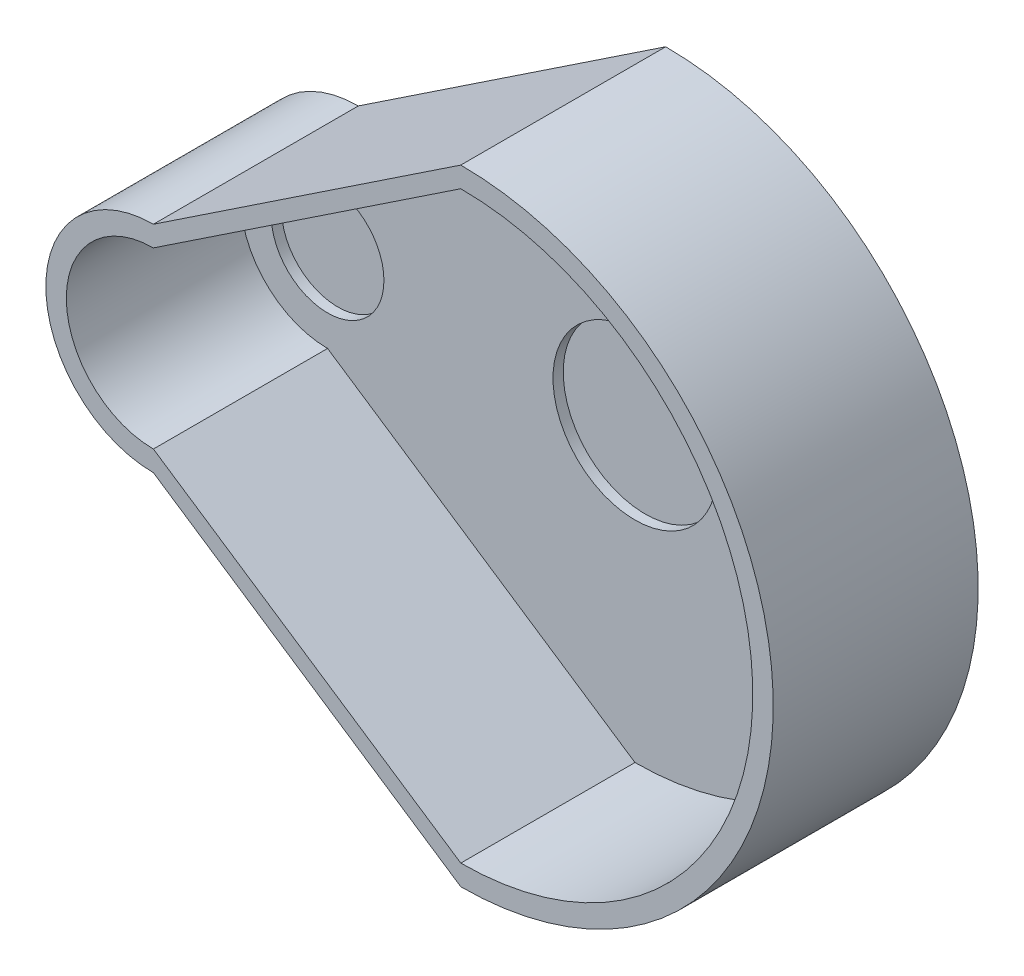
ISO-10303-21;
HEADER;
FILE_DESCRIPTION(('STEP AP214'),'2;1');
FILE_NAME('part.step','',(''),(''),'','','');
FILE_SCHEMA(('AUTOMOTIVE_DESIGN { 1 0 10303 214 1 1 1 1 }'));
ENDSEC;
DATA;
#1=APPLICATION_CONTEXT('core data for automotive mechanical design processes');
#2=APPLICATION_PROTOCOL_DEFINITION('international standard','automotive_design',2000,#1);
#3=PRODUCT_CONTEXT('',#1,'mechanical');
#4=PRODUCT('Part','Part','',(#3));
#5=PRODUCT_RELATED_PRODUCT_CATEGORY('part','',(#4));
#6=PRODUCT_DEFINITION_FORMATION('','',#4);
#7=PRODUCT_DEFINITION_CONTEXT('part definition',#1,'design');
#8=PRODUCT_DEFINITION('design','',#6,#7);
#9=PRODUCT_DEFINITION_SHAPE('','',#8);
#10=(LENGTH_UNIT() NAMED_UNIT(*) SI_UNIT(.MILLI.,.METRE.));
#11=(NAMED_UNIT(*) PLANE_ANGLE_UNIT() SI_UNIT($,.RADIAN.));
#12=(NAMED_UNIT(*) SI_UNIT($,.STERADIAN.) SOLID_ANGLE_UNIT());
#13=UNCERTAINTY_MEASURE_WITH_UNIT(LENGTH_MEASURE(1.E-05),#10,'distance_accuracy_value','');
#14=(GEOMETRIC_REPRESENTATION_CONTEXT(3) GLOBAL_UNCERTAINTY_ASSIGNED_CONTEXT((#13)) GLOBAL_UNIT_ASSIGNED_CONTEXT((#10,
#11,#12)) REPRESENTATION_CONTEXT('',''));
#15=CARTESIAN_POINT('',(0.,0.,0.));
#16=DIRECTION('',(0.,0.,1.));
#17=DIRECTION('',(1.,0.,0.));
#18=AXIS2_PLACEMENT_3D('',#15,#16,#17);
#19=CARTESIAN_POINT('',(0.,0.,20.));
#20=DIRECTION('',(0.,0.,-1.));
#21=DIRECTION('',(-1.,0.,0.));
#22=AXIS2_PLACEMENT_3D('',#19,#20,#21);
#23=CYLINDRICAL_SURFACE('',#22,21.);
#24=CARTESIAN_POINT('',(0.,0.,-20.));
#25=DIRECTION('',(0.,0.,1.));
#26=DIRECTION('',(1.,0.,0.));
#27=AXIS2_PLACEMENT_3D('',#24,#25,#26);
#28=CIRCLE('',#27,21.);
#29=CARTESIAN_POINT('',(0.,21.,-20.));
#30=VERTEX_POINT('',#29);
#31=CARTESIAN_POINT('',(0.,-21.,-20.));
#32=VERTEX_POINT('',#31);
#33=EDGE_CURVE('E153',#30,#32,#28,.T.);
#34=ORIENTED_EDGE('',*,*,#33,.T.);
#35=DIRECTION('',(0.,0.,-1.));
#36=VECTOR('',#35,1.);
#37=CARTESIAN_POINT('',(0.,-21.,20.));
#38=LINE('',#37,#36);
#39=CARTESIAN_POINT('',(0.,-21.,20.));
#40=VERTEX_POINT('',#39);
#41=EDGE_CURVE('E11',#40,#32,#38,.T.);
#42=ORIENTED_EDGE('',*,*,#41,.F.);
#43=CARTESIAN_POINT('',(0.,0.,20.));
#44=DIRECTION('',(0.,0.,1.));
#45=DIRECTION('',(1.,0.,0.));
#46=AXIS2_PLACEMENT_3D('',#43,#44,#45);
#47=CIRCLE('',#46,21.);
#48=CARTESIAN_POINT('',(0.,21.,20.));
#49=VERTEX_POINT('',#48);
#50=EDGE_CURVE('E154',#49,#40,#47,.T.);
#51=ORIENTED_EDGE('',*,*,#50,.F.);
#52=DIRECTION('',(0.,0.,-1.));
#53=VECTOR('',#52,1.);
#54=CARTESIAN_POINT('',(0.,21.,20.));
#55=LINE('',#54,#53);
#56=EDGE_CURVE('E161',#49,#30,#55,.T.);
#57=ORIENTED_EDGE('',*,*,#56,.T.);
#58=EDGE_LOOP('',(#34,#42,#51,#57));
#59=FACE_BOUND('',#58,.T.);
#60=ADVANCED_FACE('F36',(#59),#23,.T.);
#61=CARTESIAN_POINT('',(0.,-21.,20.));
#62=DIRECTION('',(0.554700196225229,0.832050294337844,0.));
#63=DIRECTION('',(-0.832050294337844,0.554700196225229,0.));
#64=AXIS2_PLACEMENT_3D('',#61,#62,#63);
#65=PLANE('',#64);
#66=DIRECTION('',(0.832050294337844,-0.554700196225229,0.));
#67=VECTOR('',#66,1.);
#68=CARTESIAN_POINT('',(0.,-21.,-20.));
#69=LINE('',#68,#67);
#70=CARTESIAN_POINT('',(60.,-61.,-20.));
#71=VERTEX_POINT('',#70);
#72=EDGE_CURVE('E162',#32,#71,#69,.T.);
#73=ORIENTED_EDGE('',*,*,#72,.T.);
#74=DIRECTION('',(0.,0.,-1.));
#75=VECTOR('',#74,1.);
#76=CARTESIAN_POINT('',(60.,-61.,20.));
#77=LINE('',#76,#75);
#78=CARTESIAN_POINT('',(60.,-61.,20.));
#79=VERTEX_POINT('',#78);
#80=EDGE_CURVE('E46',#79,#71,#77,.T.);
#81=ORIENTED_EDGE('',*,*,#80,.F.);
#82=DIRECTION('',(0.832050294337844,-0.554700196225229,0.));
#83=VECTOR('',#82,1.);
#84=CARTESIAN_POINT('',(0.,-21.,20.));
#85=LINE('',#84,#83);
#86=EDGE_CURVE('E93',#40,#79,#85,.T.);
#87=ORIENTED_EDGE('',*,*,#86,.F.);
#88=ORIENTED_EDGE('',*,*,#41,.T.);
#89=EDGE_LOOP('',(#73,#81,#87,#88));
#90=FACE_BOUND('',#89,.T.);
#91=ADVANCED_FACE('F202',(#90),#65,.F.);
#92=CARTESIAN_POINT('',(60.0000000000001,0.,20.));
#93=DIRECTION('',(0.,0.,-1.));
#94=DIRECTION('',(-1.,0.,0.));
#95=AXIS2_PLACEMENT_3D('',#92,#93,#94);
#96=CYLINDRICAL_SURFACE('',#95,61.);
#97=CARTESIAN_POINT('',(60.0000000000001,0.,-20.));
#98=DIRECTION('',(0.,0.,1.));
#99=DIRECTION('',(1.,0.,0.));
#100=AXIS2_PLACEMENT_3D('',#97,#98,#99);
#101=CIRCLE('',#100,61.);
#102=CARTESIAN_POINT('',(60.0000000000001,61.,-20.));
#103=VERTEX_POINT('',#102);
#104=EDGE_CURVE('E166',#71,#103,#101,.T.);
#105=ORIENTED_EDGE('',*,*,#104,.T.);
#106=DIRECTION('',(0.,0.,-1.));
#107=VECTOR('',#106,1.);
#108=CARTESIAN_POINT('',(60.0000000000001,61.,20.));
#109=LINE('',#108,#107);
#110=CARTESIAN_POINT('',(60.0000000000001,61.,20.));
#111=VERTEX_POINT('',#110);
#112=EDGE_CURVE('E169',#111,#103,#109,.T.);
#113=ORIENTED_EDGE('',*,*,#112,.F.);
#114=CARTESIAN_POINT('',(60.0000000000001,0.,20.));
#115=DIRECTION('',(0.,0.,1.));
#116=DIRECTION('',(1.,0.,0.));
#117=AXIS2_PLACEMENT_3D('',#114,#115,#116);
#118=CIRCLE('',#117,61.);
#119=EDGE_CURVE('E156',#79,#111,#118,.T.);
#120=ORIENTED_EDGE('',*,*,#119,.F.);
#121=ORIENTED_EDGE('',*,*,#80,.T.);
#122=EDGE_LOOP('',(#105,#113,#120,#121));
#123=FACE_BOUND('',#122,.T.);
#124=ADVANCED_FACE('F207',(#123),#96,.T.);
#125=CARTESIAN_POINT('',(0.,21.,20.));
#126=DIRECTION('',(0.554700196225229,-0.832050294337844,0.));
#127=DIRECTION('',(0.832050294337844,0.554700196225229,0.));
#128=AXIS2_PLACEMENT_3D('',#125,#126,#127);
#129=PLANE('',#128);
#130=DIRECTION('',(-0.832050294337844,-0.554700196225229,0.));
#131=VECTOR('',#130,1.);
#132=CARTESIAN_POINT('',(0.,21.,-20.));
#133=LINE('',#132,#131);
#134=EDGE_CURVE('E84',#103,#30,#133,.T.);
#135=ORIENTED_EDGE('',*,*,#134,.T.);
#136=ORIENTED_EDGE('',*,*,#56,.F.);
#137=DIRECTION('',(-0.832050294337844,-0.554700196225229,0.));
#138=VECTOR('',#137,1.);
#139=CARTESIAN_POINT('',(0.,21.,20.));
#140=LINE('',#139,#138);
#141=EDGE_CURVE('E64',#111,#49,#140,.T.);
#142=ORIENTED_EDGE('',*,*,#141,.F.);
#143=ORIENTED_EDGE('',*,*,#112,.T.);
#144=EDGE_LOOP('',(#135,#136,#142,#143));
#145=FACE_BOUND('',#144,.T.);
#146=ADVANCED_FACE('F216',(#145),#129,.F.);
#147=CARTESIAN_POINT('',(0.,0.,20.));
#148=DIRECTION('',(0.,0.,1.));
#149=DIRECTION('',(1.,0.,0.));
#150=AXIS2_PLACEMENT_3D('',#147,#148,#149);
#151=PLANE('',#150);
#152=CARTESIAN_POINT('',(0.,0.,20.));
#153=DIRECTION('',(0.,0.,1.));
#154=DIRECTION('',(1.,0.,0.));
#155=AXIS2_PLACEMENT_3D('',#152,#153,#154);
#156=CIRCLE('',#155,17.);
#157=CARTESIAN_POINT('',(0.,17.,20.));
#158=VERTEX_POINT('',#157);
#159=CARTESIAN_POINT('',(0.,-17.,20.));
#160=VERTEX_POINT('',#159);
#161=EDGE_CURVE('E53',#158,#160,#156,.T.);
#162=ORIENTED_EDGE('',*,*,#161,.F.);
#163=DIRECTION('',(-0.832050294337841,-0.554700196225233,0.));
#164=VECTOR('',#163,1.);
#165=CARTESIAN_POINT('',(0.,17.,20.));
#166=LINE('',#165,#164);
#167=CARTESIAN_POINT('',(59.9999999999997,57.0000000000002,20.));
#168=VERTEX_POINT('',#167);
#169=EDGE_CURVE('E134',#168,#158,#166,.T.);
#170=ORIENTED_EDGE('',*,*,#169,.F.);
#171=CARTESIAN_POINT('',(59.9999999999997,-2.22044604925031E-13,20.));
#172=DIRECTION('',(0.,0.,1.));
#173=DIRECTION('',(1.,0.,0.));
#174=AXIS2_PLACEMENT_3D('',#171,#172,#173);
#175=CIRCLE('',#174,57.0000000000002);
#176=CARTESIAN_POINT('',(59.9999999999997,-57.0000000000004,20.));
#177=VERTEX_POINT('',#176);
#178=EDGE_CURVE('E137',#177,#168,#175,.T.);
#179=ORIENTED_EDGE('',*,*,#178,.F.);
#180=DIRECTION('',(0.832050294337841,-0.554700196225233,0.));
#181=VECTOR('',#180,1.);
#182=CARTESIAN_POINT('',(0.,-17.,20.));
#183=LINE('',#182,#181);
#184=EDGE_CURVE('E141',#160,#177,#183,.T.);
#185=ORIENTED_EDGE('',*,*,#184,.F.);
#186=EDGE_LOOP('',(#162,#170,#179,#185));
#187=FACE_BOUND('',#186,.T.);
#188=ORIENTED_EDGE('',*,*,#50,.T.);
#189=ORIENTED_EDGE('',*,*,#86,.T.);
#190=ORIENTED_EDGE('',*,*,#119,.T.);
#191=ORIENTED_EDGE('',*,*,#141,.T.);
#192=EDGE_LOOP('',(#188,#189,#190,#191));
#193=FACE_BOUND('',#192,.T.);
#194=ADVANCED_FACE('F218',(#187,#193),#151,.T.);
#195=CARTESIAN_POINT('',(0.,0.,-20.));
#196=DIRECTION('',(0.,0.,1.));
#197=DIRECTION('',(1.,0.,0.));
#198=AXIS2_PLACEMENT_3D('',#195,#196,#197);
#199=PLANE('',#198);
#200=ORIENTED_EDGE('',*,*,#33,.F.);
#201=ORIENTED_EDGE('',*,*,#134,.F.);
#202=ORIENTED_EDGE('',*,*,#104,.F.);
#203=ORIENTED_EDGE('',*,*,#72,.F.);
#204=EDGE_LOOP('',(#200,#201,#202,#203));
#205=FACE_BOUND('',#204,.T.);
#206=ADVANCED_FACE('F213',(#205),#199,.F.);
#207=CARTESIAN_POINT('',(0.,0.,-14.));
#208=DIRECTION('',(0.,0.,1.));
#209=DIRECTION('',(1.,0.,0.));
#210=AXIS2_PLACEMENT_3D('',#207,#208,#209);
#211=CYLINDRICAL_SURFACE('',#210,17.);
#212=ORIENTED_EDGE('',*,*,#161,.T.);
#213=DIRECTION('',(0.,0.,1.));
#214=VECTOR('',#213,1.);
#215=CARTESIAN_POINT('',(0.,-17.,-14.));
#216=LINE('',#215,#214);
#217=CARTESIAN_POINT('',(0.,-17.,-14.));
#218=VERTEX_POINT('',#217);
#219=EDGE_CURVE('E111',#218,#160,#216,.T.);
#220=ORIENTED_EDGE('',*,*,#219,.F.);
#221=CARTESIAN_POINT('',(0.,0.,-14.));
#222=DIRECTION('',(0.,0.,1.));
#223=DIRECTION('',(1.,0.,0.));
#224=AXIS2_PLACEMENT_3D('',#221,#222,#223);
#225=CIRCLE('',#224,17.);
#226=CARTESIAN_POINT('',(0.,17.,-14.));
#227=VERTEX_POINT('',#226);
#228=EDGE_CURVE('E114',#227,#218,#225,.T.);
#229=ORIENTED_EDGE('',*,*,#228,.F.);
#230=DIRECTION('',(0.,0.,1.));
#231=VECTOR('',#230,1.);
#232=CARTESIAN_POINT('',(0.,17.,-14.));
#233=LINE('',#232,#231);
#234=EDGE_CURVE('E149',#227,#158,#233,.T.);
#235=ORIENTED_EDGE('',*,*,#234,.T.);
#236=EDGE_LOOP('',(#212,#220,#229,#235));
#237=FACE_BOUND('',#236,.T.);
#238=ADVANCED_FACE('F112',(#237),#211,.F.);
#239=CARTESIAN_POINT('',(0.,17.,-14.));
#240=DIRECTION('',(-0.554700196225233,0.832050294337841,0.));
#241=DIRECTION('',(-0.832050294337841,-0.554700196225233,0.));
#242=AXIS2_PLACEMENT_3D('',#239,#240,#241);
#243=PLANE('',#242);
#244=ORIENTED_EDGE('',*,*,#169,.T.);
#245=ORIENTED_EDGE('',*,*,#234,.F.);
#246=DIRECTION('',(-0.832050294337841,-0.554700196225233,0.));
#247=VECTOR('',#246,1.);
#248=CARTESIAN_POINT('',(0.,17.,-14.));
#249=LINE('',#248,#247);
#250=CARTESIAN_POINT('',(59.9999999999997,57.0000000000002,-14.));
#251=VERTEX_POINT('',#250);
#252=EDGE_CURVE('E122',#251,#227,#249,.T.);
#253=ORIENTED_EDGE('',*,*,#252,.F.);
#254=DIRECTION('',(0.,0.,1.));
#255=VECTOR('',#254,1.);
#256=CARTESIAN_POINT('',(59.9999999999997,57.0000000000002,-14.));
#257=LINE('',#256,#255);
#258=EDGE_CURVE('E152',#251,#168,#257,.T.);
#259=ORIENTED_EDGE('',*,*,#258,.T.);
#260=EDGE_LOOP('',(#244,#245,#253,#259));
#261=FACE_BOUND('',#260,.T.);
#262=ADVANCED_FACE('F256',(#261),#243,.F.);
#263=CARTESIAN_POINT('',(59.9999999999997,-2.22044604925031E-13,-14.));
#264=DIRECTION('',(0.,0.,1.));
#265=DIRECTION('',(1.,0.,0.));
#266=AXIS2_PLACEMENT_3D('',#263,#264,#265);
#267=CYLINDRICAL_SURFACE('',#266,57.0000000000002);
#268=ORIENTED_EDGE('',*,*,#178,.T.);
#269=ORIENTED_EDGE('',*,*,#258,.F.);
#270=CARTESIAN_POINT('',(59.9999999999997,-2.22044604925031E-13,-14.));
#271=DIRECTION('',(0.,0.,1.));
#272=DIRECTION('',(1.,0.,0.));
#273=AXIS2_PLACEMENT_3D('',#270,#271,#272);
#274=CIRCLE('',#273,57.0000000000002);
#275=CARTESIAN_POINT('',(59.9999999999997,-57.0000000000004,-14.));
#276=VERTEX_POINT('',#275);
#277=EDGE_CURVE('E127',#276,#251,#274,.T.);
#278=ORIENTED_EDGE('',*,*,#277,.F.);
#279=DIRECTION('',(0.,0.,1.));
#280=VECTOR('',#279,1.);
#281=CARTESIAN_POINT('',(59.9999999999997,-57.0000000000004,-14.));
#282=LINE('',#281,#280);
#283=EDGE_CURVE('E118',#276,#177,#282,.T.);
#284=ORIENTED_EDGE('',*,*,#283,.T.);
#285=EDGE_LOOP('',(#268,#269,#278,#284));
#286=FACE_BOUND('',#285,.T.);
#287=ADVANCED_FACE('F267',(#286),#267,.F.);
#288=CARTESIAN_POINT('',(0.,-17.,-14.));
#289=DIRECTION('',(-0.554700196225233,-0.832050294337841,0.));
#290=DIRECTION('',(0.832050294337841,-0.554700196225233,0.));
#291=AXIS2_PLACEMENT_3D('',#288,#289,#290);
#292=PLANE('',#291);
#293=ORIENTED_EDGE('',*,*,#184,.T.);
#294=ORIENTED_EDGE('',*,*,#283,.F.);
#295=DIRECTION('',(0.832050294337841,-0.554700196225233,0.));
#296=VECTOR('',#295,1.);
#297=CARTESIAN_POINT('',(0.,-17.,-14.));
#298=LINE('',#297,#296);
#299=EDGE_CURVE('E121',#218,#276,#298,.T.);
#300=ORIENTED_EDGE('',*,*,#299,.F.);
#301=ORIENTED_EDGE('',*,*,#219,.T.);
#302=EDGE_LOOP('',(#293,#294,#300,#301));
#303=FACE_BOUND('',#302,.T.);
#304=ADVANCED_FACE('F123',(#303),#292,.F.);
#305=CARTESIAN_POINT('',(0.,0.,-14.));
#306=DIRECTION('',(0.,0.,1.));
#307=DIRECTION('',(1.,0.,0.));
#308=AXIS2_PLACEMENT_3D('',#305,#306,#307);
#309=PLANE('',#308);
#310=CARTESIAN_POINT('',(0.,0.,-14.));
#311=DIRECTION('',(0.,0.,1.));
#312=DIRECTION('',(1.,0.,0.));
#313=AXIS2_PLACEMENT_3D('',#310,#311,#312);
#314=CIRCLE('',#313,11.);
#315=CARTESIAN_POINT('',(11.,0.,-14.));
#316=VERTEX_POINT('',#315);
#317=EDGE_CURVE('E41',#316,#316,#314,.F.);
#318=ORIENTED_EDGE('',*,*,#317,.T.);
#319=EDGE_LOOP('',(#318));
#320=FACE_BOUND('',#319,.T.);
#321=CARTESIAN_POINT('',(60.,0.,-14.));
#322=DIRECTION('',(0.,0.,1.));
#323=DIRECTION('',(1.,0.,0.));
#324=AXIS2_PLACEMENT_3D('',#321,#322,#323);
#325=CIRCLE('',#324,16.);
#326=CARTESIAN_POINT('',(76.,0.,-14.));
#327=VERTEX_POINT('',#326);
#328=EDGE_CURVE('E172',#327,#327,#325,.F.);
#329=ORIENTED_EDGE('',*,*,#328,.T.);
#330=EDGE_LOOP('',(#329));
#331=FACE_BOUND('',#330,.T.);
#332=ORIENTED_EDGE('',*,*,#228,.T.);
#333=ORIENTED_EDGE('',*,*,#299,.T.);
#334=ORIENTED_EDGE('',*,*,#277,.T.);
#335=ORIENTED_EDGE('',*,*,#252,.T.);
#336=EDGE_LOOP('',(#332,#333,#334,#335));
#337=FACE_BOUND('',#336,.T.);
#338=ADVANCED_FACE('F132',(#320,#331,#337),#309,.T.);
#339=CARTESIAN_POINT('',(60.,0.,20.));
#340=DIRECTION('',(0.,0.,-1.));
#341=DIRECTION('',(-1.,0.,0.));
#342=AXIS2_PLACEMENT_3D('',#339,#340,#341);
#343=CYLINDRICAL_SURFACE('',#342,16.);
#344=ORIENTED_EDGE('',*,*,#328,.F.);
#345=EDGE_LOOP('',(#344));
#346=FACE_BOUND('',#345,.T.);
#347=CARTESIAN_POINT('',(60.,0.,-16.));
#348=DIRECTION('',(0.,0.,1.));
#349=DIRECTION('',(1.,0.,0.));
#350=AXIS2_PLACEMENT_3D('',#347,#348,#349);
#351=CIRCLE('',#350,16.);
#352=CARTESIAN_POINT('',(76.,0.,-16.));
#353=VERTEX_POINT('',#352);
#354=EDGE_CURVE('E139',#353,#353,#351,.T.);
#355=ORIENTED_EDGE('',*,*,#354,.F.);
#356=EDGE_LOOP('',(#355));
#357=FACE_BOUND('',#356,.T.);
#358=ADVANCED_FACE('F190',(#346,#357),#343,.F.);
#359=CARTESIAN_POINT('',(60.,0.,-16.));
#360=DIRECTION('',(0.,0.,1.));
#361=DIRECTION('',(1.,0.,0.));
#362=AXIS2_PLACEMENT_3D('',#359,#360,#361);
#363=PLANE('',#362);
#364=ORIENTED_EDGE('',*,*,#354,.T.);
#365=EDGE_LOOP('',(#364));
#366=FACE_BOUND('',#365,.T.);
#367=ADVANCED_FACE('F183',(#366),#363,.T.);
#368=CARTESIAN_POINT('',(0.,0.,20.));
#369=DIRECTION('',(0.,0.,-1.));
#370=DIRECTION('',(-1.,0.,0.));
#371=AXIS2_PLACEMENT_3D('',#368,#369,#370);
#372=CYLINDRICAL_SURFACE('',#371,11.);
#373=ORIENTED_EDGE('',*,*,#317,.F.);
#374=EDGE_LOOP('',(#373));
#375=FACE_BOUND('',#374,.T.);
#376=CARTESIAN_POINT('',(0.,0.,-16.));
#377=DIRECTION('',(0.,0.,1.));
#378=DIRECTION('',(1.,0.,0.));
#379=AXIS2_PLACEMENT_3D('',#376,#377,#378);
#380=CIRCLE('',#379,11.);
#381=CARTESIAN_POINT('',(11.,0.,-16.));
#382=VERTEX_POINT('',#381);
#383=EDGE_CURVE('E174',#382,#382,#380,.T.);
#384=ORIENTED_EDGE('',*,*,#383,.F.);
#385=EDGE_LOOP('',(#384));
#386=FACE_BOUND('',#385,.T.);
#387=ADVANCED_FACE('F193',(#375,#386),#372,.F.);
#388=CARTESIAN_POINT('',(0.,0.,-16.));
#389=DIRECTION('',(0.,0.,1.));
#390=DIRECTION('',(1.,0.,0.));
#391=AXIS2_PLACEMENT_3D('',#388,#389,#390);
#392=PLANE('',#391);
#393=ORIENTED_EDGE('',*,*,#383,.T.);
#394=EDGE_LOOP('',(#393));
#395=FACE_BOUND('',#394,.T.);
#396=ADVANCED_FACE('F308',(#395),#392,.T.);
#397=CLOSED_SHELL('',(#60,#91,#124,#146,#194,#206,#238,#262,#287,#304,#338,#358,#367,#387,#396));
#398=MANIFOLD_SOLID_BREP('B2',#397);
#399=ADVANCED_BREP_SHAPE_REPRESENTATION('',(#18,#398),#14);
#400=SHAPE_DEFINITION_REPRESENTATION(#9,#399);
ENDSEC;
END-ISO-10303-21;
